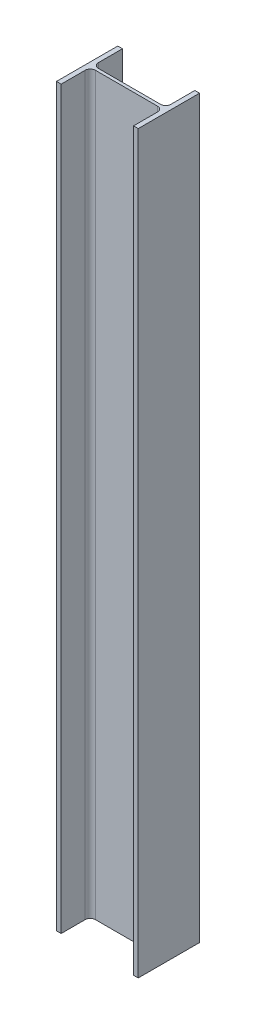
ISO-10303-21;
HEADER;
FILE_DESCRIPTION(('STEP AP214'),'2;1');
FILE_NAME('part.step','',(''),(''),'','','');
FILE_SCHEMA(('AUTOMOTIVE_DESIGN { 1 0 10303 214 1 1 1 1 }'));
ENDSEC;
DATA;
#1=APPLICATION_CONTEXT('core data for automotive mechanical design processes');
#2=APPLICATION_PROTOCOL_DEFINITION('international standard','automotive_design',2000,#1);
#3=PRODUCT_CONTEXT('',#1,'mechanical');
#4=PRODUCT('Part','Part','',(#3));
#5=PRODUCT_RELATED_PRODUCT_CATEGORY('part','',(#4));
#6=PRODUCT_DEFINITION_FORMATION('','',#4);
#7=PRODUCT_DEFINITION_CONTEXT('part definition',#1,'design');
#8=PRODUCT_DEFINITION('design','',#6,#7);
#9=PRODUCT_DEFINITION_SHAPE('','',#8);
#10=(LENGTH_UNIT() NAMED_UNIT(*) SI_UNIT(.MILLI.,.METRE.));
#11=(NAMED_UNIT(*) PLANE_ANGLE_UNIT() SI_UNIT($,.RADIAN.));
#12=(NAMED_UNIT(*) SI_UNIT($,.STERADIAN.) SOLID_ANGLE_UNIT());
#13=UNCERTAINTY_MEASURE_WITH_UNIT(LENGTH_MEASURE(1.E-05),#10,'distance_accuracy_value','');
#14=(GEOMETRIC_REPRESENTATION_CONTEXT(3) GLOBAL_UNCERTAINTY_ASSIGNED_CONTEXT((#13)) GLOBAL_UNIT_ASSIGNED_CONTEXT((#10,
#11,#12)) REPRESENTATION_CONTEXT('',''));
#15=CARTESIAN_POINT('',(0.,0.,0.));
#16=DIRECTION('',(0.,0.,1.));
#17=DIRECTION('',(1.,0.,0.));
#18=AXIS2_PLACEMENT_3D('',#15,#16,#17);
#19=CARTESIAN_POINT('',(104.775,457.2,-76.2000000000002));
#20=DIRECTION('',(-1.,0.,0.));
#21=DIRECTION('',(0.,0.,1.));
#22=AXIS2_PLACEMENT_3D('',#19,#20,#21);
#23=PLANE('',#22);
#24=DIRECTION('',(0.,0.,-1.));
#25=VECTOR('',#24,1.);
#26=CARTESIAN_POINT('',(104.775,-457.2,-76.2000000000002));
#27=LINE('',#26,#25);
#28=CARTESIAN_POINT('',(104.775,-457.2,-1.59594559789866E-13));
#29=VERTEX_POINT('',#28);
#30=CARTESIAN_POINT('',(104.775,-457.2,-76.2000000000002));
#31=VERTEX_POINT('',#30);
#32=EDGE_CURVE('E238',#29,#31,#27,.T.);
#33=ORIENTED_EDGE('',*,*,#32,.T.);
#34=DIRECTION('',(0.,-1.,0.));
#35=VECTOR('',#34,1.);
#36=CARTESIAN_POINT('',(104.775,457.2,-76.2000000000002));
#37=LINE('',#36,#35);
#38=CARTESIAN_POINT('',(104.775,457.2,-76.2000000000002));
#39=VERTEX_POINT('',#38);
#40=EDGE_CURVE('E13',#39,#31,#37,.T.);
#41=ORIENTED_EDGE('',*,*,#40,.F.);
#42=DIRECTION('',(0.,0.,-1.));
#43=VECTOR('',#42,1.);
#44=CARTESIAN_POINT('',(104.775,457.2,-76.2000000000002));
#45=LINE('',#44,#43);
#46=CARTESIAN_POINT('',(104.775,457.2,-1.59594559789866E-13));
#47=VERTEX_POINT('',#46);
#48=EDGE_CURVE('E268',#47,#39,#45,.T.);
#49=ORIENTED_EDGE('',*,*,#48,.F.);
#50=DIRECTION('',(0.,-1.,0.));
#51=VECTOR('',#50,1.);
#52=CARTESIAN_POINT('',(104.775,457.2,-1.59594559789866E-13));
#53=LINE('',#52,#51);
#54=EDGE_CURVE('E234',#47,#29,#53,.T.);
#55=ORIENTED_EDGE('',*,*,#54,.T.);
#56=EDGE_LOOP('',(#33,#41,#49,#55));
#57=FACE_BOUND('',#56,.T.);
#58=ADVANCED_FACE('F94',(#57),#23,.F.);
#59=CARTESIAN_POINT('',(98.9329999999999,457.2,-76.2000000000002));
#60=DIRECTION('',(0.,0.,1.));
#61=DIRECTION('',(1.,0.,0.));
#62=AXIS2_PLACEMENT_3D('',#59,#60,#61);
#63=PLANE('',#62);
#64=DIRECTION('',(-1.,0.,0.));
#65=VECTOR('',#64,1.);
#66=CARTESIAN_POINT('',(98.9329999999999,-457.2,-76.2000000000002));
#67=LINE('',#66,#65);
#68=CARTESIAN_POINT('',(98.9329999999999,-457.2,-76.2000000000002));
#69=VERTEX_POINT('',#68);
#70=EDGE_CURVE('E241',#31,#69,#67,.T.);
#71=ORIENTED_EDGE('',*,*,#70,.T.);
#72=DIRECTION('',(0.,-1.,0.));
#73=VECTOR('',#72,1.);
#74=CARTESIAN_POINT('',(98.9329999999999,457.2,-76.2000000000002));
#75=LINE('',#74,#73);
#76=CARTESIAN_POINT('',(98.9329999999999,457.2,-76.2000000000002));
#77=VERTEX_POINT('',#76);
#78=EDGE_CURVE('E102',#77,#69,#75,.T.);
#79=ORIENTED_EDGE('',*,*,#78,.F.);
#80=DIRECTION('',(-1.,0.,0.));
#81=VECTOR('',#80,1.);
#82=CARTESIAN_POINT('',(98.9329999999999,457.2,-76.2000000000002));
#83=LINE('',#82,#81);
#84=EDGE_CURVE('E177',#39,#77,#83,.T.);
#85=ORIENTED_EDGE('',*,*,#84,.F.);
#86=ORIENTED_EDGE('',*,*,#40,.T.);
#87=EDGE_LOOP('',(#71,#79,#85,#86));
#88=FACE_BOUND('',#87,.T.);
#89=ADVANCED_FACE('F366',(#88),#63,.F.);
#90=CARTESIAN_POINT('',(98.933,457.2,-46.3550000000002));
#91=DIRECTION('',(1.,0.,0.));
#92=DIRECTION('',(0.,0.,-1.));
#93=AXIS2_PLACEMENT_3D('',#90,#91,#92);
#94=PLANE('',#93);
#95=DIRECTION('',(0.,0.,1.));
#96=VECTOR('',#95,1.);
#97=CARTESIAN_POINT('',(98.933,-457.2,-46.3550000000002));
#98=LINE('',#97,#96);
#99=CARTESIAN_POINT('',(98.933,-457.2,-46.3550000000002));
#100=VERTEX_POINT('',#99);
#101=EDGE_CURVE('E243',#69,#100,#98,.T.);
#102=ORIENTED_EDGE('',*,*,#101,.T.);
#103=DIRECTION('',(0.,-1.,0.));
#104=VECTOR('',#103,1.);
#105=CARTESIAN_POINT('',(98.933,457.2,-46.3550000000002));
#106=LINE('',#105,#104);
#107=CARTESIAN_POINT('',(98.933,457.2,-46.3550000000002));
#108=VERTEX_POINT('',#107);
#109=EDGE_CURVE('E299',#108,#100,#106,.T.);
#110=ORIENTED_EDGE('',*,*,#109,.F.);
#111=DIRECTION('',(0.,0.,1.));
#112=VECTOR('',#111,1.);
#113=CARTESIAN_POINT('',(98.933,457.2,-46.3550000000002));
#114=LINE('',#113,#112);
#115=EDGE_CURVE('E307',#77,#108,#114,.T.);
#116=ORIENTED_EDGE('',*,*,#115,.F.);
#117=ORIENTED_EDGE('',*,*,#78,.T.);
#118=EDGE_LOOP('',(#102,#110,#116,#117));
#119=FACE_BOUND('',#118,.T.);
#120=ADVANCED_FACE('F305',(#119),#94,.F.);
#121=CARTESIAN_POINT('',(92.5829999999999,457.2,-46.3550000000001));
#122=DIRECTION('',(0.,-1.,0.));
#123=DIRECTION('',(0.,0.,-1.));
#124=AXIS2_PLACEMENT_3D('',#121,#122,#123);
#125=CYLINDRICAL_SURFACE('',#124,6.35000000000001);
#126=CARTESIAN_POINT('',(92.5829999999999,-457.2,-46.3550000000001));
#127=DIRECTION('',(0.,-1.,0.));
#128=DIRECTION('',(0.,0.,1.));
#129=AXIS2_PLACEMENT_3D('',#126,#127,#128);
#130=CIRCLE('',#129,6.35000000000001);
#131=CARTESIAN_POINT('',(92.583,-457.2,-40.0050000000002));
#132=VERTEX_POINT('',#131);
#133=EDGE_CURVE('E245',#100,#132,#130,.T.);
#134=ORIENTED_EDGE('',*,*,#133,.T.);
#135=DIRECTION('',(0.,-1.,0.));
#136=VECTOR('',#135,1.);
#137=CARTESIAN_POINT('',(92.583,457.2,-40.0050000000002));
#138=LINE('',#137,#136);
#139=CARTESIAN_POINT('',(92.583,457.2,-40.0050000000002));
#140=VERTEX_POINT('',#139);
#141=EDGE_CURVE('E296',#140,#132,#138,.T.);
#142=ORIENTED_EDGE('',*,*,#141,.F.);
#143=CARTESIAN_POINT('',(92.5829999999999,457.2,-46.3550000000001));
#144=DIRECTION('',(0.,-1.,0.));
#145=DIRECTION('',(0.,0.,1.));
#146=AXIS2_PLACEMENT_3D('',#143,#144,#145);
#147=CIRCLE('',#146,6.35000000000001);
#148=EDGE_CURVE('E325',#108,#140,#147,.T.);
#149=ORIENTED_EDGE('',*,*,#148,.F.);
#150=ORIENTED_EDGE('',*,*,#109,.T.);
#151=EDGE_LOOP('',(#134,#142,#149,#150));
#152=FACE_BOUND('',#151,.T.);
#153=ADVANCED_FACE('F316',(#152),#125,.F.);
#154=CARTESIAN_POINT('',(15.367,457.2,-40.0049999999999));
#155=DIRECTION('',(0.,0.,1.));
#156=DIRECTION('',(1.,0.,0.));
#157=AXIS2_PLACEMENT_3D('',#154,#155,#156);
#158=PLANE('',#157);
#159=DIRECTION('',(-1.,0.,0.));
#160=VECTOR('',#159,1.);
#161=CARTESIAN_POINT('',(15.367,-457.2,-40.0049999999999));
#162=LINE('',#161,#160);
#163=CARTESIAN_POINT('',(15.367,-457.2,-40.0049999999999));
#164=VERTEX_POINT('',#163);
#165=EDGE_CURVE('E247',#132,#164,#162,.T.);
#166=ORIENTED_EDGE('',*,*,#165,.T.);
#167=DIRECTION('',(0.,-1.,0.));
#168=VECTOR('',#167,1.);
#169=CARTESIAN_POINT('',(15.367,457.2,-40.0049999999999));
#170=LINE('',#169,#168);
#171=CARTESIAN_POINT('',(15.367,457.2,-40.0049999999999));
#172=VERTEX_POINT('',#171);
#173=EDGE_CURVE('E293',#172,#164,#170,.T.);
#174=ORIENTED_EDGE('',*,*,#173,.F.);
#175=DIRECTION('',(-1.,0.,0.));
#176=VECTOR('',#175,1.);
#177=CARTESIAN_POINT('',(15.367,457.2,-40.0049999999999));
#178=LINE('',#177,#176);
#179=EDGE_CURVE('E322',#140,#172,#178,.T.);
#180=ORIENTED_EDGE('',*,*,#179,.F.);
#181=ORIENTED_EDGE('',*,*,#141,.T.);
#182=EDGE_LOOP('',(#166,#174,#180,#181));
#183=FACE_BOUND('',#182,.T.);
#184=ADVANCED_FACE('F320',(#183),#158,.F.);
#185=CARTESIAN_POINT('',(15.367,457.2,-46.3549999999999));
#186=DIRECTION('',(0.,-1.,0.));
#187=DIRECTION('',(0.,0.,-1.));
#188=AXIS2_PLACEMENT_3D('',#185,#186,#187);
#189=CYLINDRICAL_SURFACE('',#188,6.35000000000001);
#190=CARTESIAN_POINT('',(15.367,-457.2,-46.3549999999999));
#191=DIRECTION('',(0.,-1.,0.));
#192=DIRECTION('',(0.,0.,1.));
#193=AXIS2_PLACEMENT_3D('',#190,#191,#192);
#194=CIRCLE('',#193,6.35000000000001);
#195=CARTESIAN_POINT('',(9.01699999999996,-457.2,-46.3549999999999));
#196=VERTEX_POINT('',#195);
#197=EDGE_CURVE('E249',#164,#196,#194,.T.);
#198=ORIENTED_EDGE('',*,*,#197,.T.);
#199=DIRECTION('',(0.,-1.,0.));
#200=VECTOR('',#199,1.);
#201=CARTESIAN_POINT('',(9.01699999999996,457.2,-46.3549999999999));
#202=LINE('',#201,#200);
#203=CARTESIAN_POINT('',(9.01699999999996,457.2,-46.3549999999999));
#204=VERTEX_POINT('',#203);
#205=EDGE_CURVE('E290',#204,#196,#202,.T.);
#206=ORIENTED_EDGE('',*,*,#205,.F.);
#207=CARTESIAN_POINT('',(15.367,457.2,-46.3549999999999));
#208=DIRECTION('',(0.,-1.,0.));
#209=DIRECTION('',(0.,0.,1.));
#210=AXIS2_PLACEMENT_3D('',#207,#208,#209);
#211=CIRCLE('',#210,6.35000000000001);
#212=EDGE_CURVE('E324',#172,#204,#211,.T.);
#213=ORIENTED_EDGE('',*,*,#212,.F.);
#214=ORIENTED_EDGE('',*,*,#173,.T.);
#215=EDGE_LOOP('',(#198,#206,#213,#214));
#216=FACE_BOUND('',#215,.T.);
#217=ADVANCED_FACE('F379',(#216),#189,.F.);
#218=CARTESIAN_POINT('',(9.01699999999987,457.2,-76.1999999999999));
#219=DIRECTION('',(-1.,0.,0.));
#220=DIRECTION('',(0.,0.,1.));
#221=AXIS2_PLACEMENT_3D('',#218,#219,#220);
#222=PLANE('',#221);
#223=DIRECTION('',(0.,0.,-1.));
#224=VECTOR('',#223,1.);
#225=CARTESIAN_POINT('',(9.01699999999987,-457.2,-76.1999999999999));
#226=LINE('',#225,#224);
#227=CARTESIAN_POINT('',(9.01699999999987,-457.2,-76.1999999999999));
#228=VERTEX_POINT('',#227);
#229=EDGE_CURVE('E251',#196,#228,#226,.T.);
#230=ORIENTED_EDGE('',*,*,#229,.T.);
#231=DIRECTION('',(0.,-1.,0.));
#232=VECTOR('',#231,1.);
#233=CARTESIAN_POINT('',(9.01699999999987,457.2,-76.1999999999999));
#234=LINE('',#233,#232);
#235=CARTESIAN_POINT('',(9.01699999999987,457.2,-76.1999999999999));
#236=VERTEX_POINT('',#235);
#237=EDGE_CURVE('E287',#236,#228,#234,.T.);
#238=ORIENTED_EDGE('',*,*,#237,.F.);
#239=DIRECTION('',(0.,0.,-1.));
#240=VECTOR('',#239,1.);
#241=CARTESIAN_POINT('',(9.01699999999987,457.2,-76.1999999999999));
#242=LINE('',#241,#240);
#243=EDGE_CURVE('E327',#204,#236,#242,.T.);
#244=ORIENTED_EDGE('',*,*,#243,.F.);
#245=ORIENTED_EDGE('',*,*,#205,.T.);
#246=EDGE_LOOP('',(#230,#238,#244,#245));
#247=FACE_BOUND('',#246,.T.);
#248=ADVANCED_FACE('F382',(#247),#222,.F.);
#249=CARTESIAN_POINT('',(3.17499999999985,457.2,-76.1999999999998));
#250=DIRECTION('',(0.,0.,1.));
#251=DIRECTION('',(1.,0.,0.));
#252=AXIS2_PLACEMENT_3D('',#249,#250,#251);
#253=PLANE('',#252);
#254=DIRECTION('',(-1.,0.,0.));
#255=VECTOR('',#254,1.);
#256=CARTESIAN_POINT('',(3.17499999999985,-457.2,-76.1999999999998));
#257=LINE('',#256,#255);
#258=CARTESIAN_POINT('',(3.17499999999985,-457.2,-76.1999999999998));
#259=VERTEX_POINT('',#258);
#260=EDGE_CURVE('E253',#228,#259,#257,.T.);
#261=ORIENTED_EDGE('',*,*,#260,.T.);
#262=DIRECTION('',(0.,-1.,0.));
#263=VECTOR('',#262,1.);
#264=CARTESIAN_POINT('',(3.17499999999985,457.2,-76.1999999999998));
#265=LINE('',#264,#263);
#266=CARTESIAN_POINT('',(3.17499999999985,457.2,-76.1999999999998));
#267=VERTEX_POINT('',#266);
#268=EDGE_CURVE('E284',#267,#259,#265,.T.);
#269=ORIENTED_EDGE('',*,*,#268,.F.);
#270=DIRECTION('',(-1.,0.,0.));
#271=VECTOR('',#270,1.);
#272=CARTESIAN_POINT('',(3.17499999999985,457.2,-76.1999999999998));
#273=LINE('',#272,#271);
#274=EDGE_CURVE('E333',#236,#267,#273,.T.);
#275=ORIENTED_EDGE('',*,*,#274,.F.);
#276=ORIENTED_EDGE('',*,*,#237,.T.);
#277=EDGE_LOOP('',(#261,#269,#275,#276));
#278=FACE_BOUND('',#277,.T.);
#279=ADVANCED_FACE('F386',(#278),#253,.F.);
#280=CARTESIAN_POINT('',(3.17500000000012,457.2,1.87350135405495E-13));
#281=DIRECTION('',(1.,0.,0.));
#282=DIRECTION('',(0.,0.,-1.));
#283=AXIS2_PLACEMENT_3D('',#280,#281,#282);
#284=PLANE('',#283);
#285=DIRECTION('',(0.,0.,1.));
#286=VECTOR('',#285,1.);
#287=CARTESIAN_POINT('',(3.17500000000012,-457.2,1.87350135405495E-13));
#288=LINE('',#287,#286);
#289=CARTESIAN_POINT('',(3.17500000000012,-457.2,1.87350135405495E-13));
#290=VERTEX_POINT('',#289);
#291=EDGE_CURVE('E255',#259,#290,#288,.T.);
#292=ORIENTED_EDGE('',*,*,#291,.T.);
#293=DIRECTION('',(0.,-1.,0.));
#294=VECTOR('',#293,1.);
#295=CARTESIAN_POINT('',(3.17500000000012,457.2,1.87350135405495E-13));
#296=LINE('',#295,#294);
#297=CARTESIAN_POINT('',(3.17500000000012,457.2,1.87350135405495E-13));
#298=VERTEX_POINT('',#297);
#299=EDGE_CURVE('E281',#298,#290,#296,.T.);
#300=ORIENTED_EDGE('',*,*,#299,.F.);
#301=DIRECTION('',(0.,0.,1.));
#302=VECTOR('',#301,1.);
#303=CARTESIAN_POINT('',(3.17500000000012,457.2,1.87350135405495E-13));
#304=LINE('',#303,#302);
#305=EDGE_CURVE('E335',#267,#298,#304,.T.);
#306=ORIENTED_EDGE('',*,*,#305,.F.);
#307=ORIENTED_EDGE('',*,*,#268,.T.);
#308=EDGE_LOOP('',(#292,#300,#306,#307));
#309=FACE_BOUND('',#308,.T.);
#310=ADVANCED_FACE('F390',(#309),#284,.F.);
#311=CARTESIAN_POINT('',(9.01700000000014,457.2,1.94289029309402E-13));
#312=DIRECTION('',(0.,0.,-1.));
#313=DIRECTION('',(-1.,0.,0.));
#314=AXIS2_PLACEMENT_3D('',#311,#312,#313);
#315=PLANE('',#314);
#316=DIRECTION('',(1.,0.,0.));
#317=VECTOR('',#316,1.);
#318=CARTESIAN_POINT('',(9.01700000000014,-457.2,1.94289029309402E-13));
#319=LINE('',#318,#317);
#320=CARTESIAN_POINT('',(9.01700000000014,-457.2,1.94289029309402E-13));
#321=VERTEX_POINT('',#320);
#322=EDGE_CURVE('E257',#290,#321,#319,.T.);
#323=ORIENTED_EDGE('',*,*,#322,.T.);
#324=DIRECTION('',(0.,-1.,0.));
#325=VECTOR('',#324,1.);
#326=CARTESIAN_POINT('',(9.01700000000014,457.2,1.94289029309402E-13));
#327=LINE('',#326,#325);
#328=CARTESIAN_POINT('',(9.01700000000014,457.2,1.94289029309402E-13));
#329=VERTEX_POINT('',#328);
#330=EDGE_CURVE('E278',#329,#321,#327,.T.);
#331=ORIENTED_EDGE('',*,*,#330,.F.);
#332=DIRECTION('',(1.,0.,0.));
#333=VECTOR('',#332,1.);
#334=CARTESIAN_POINT('',(9.01700000000014,457.2,1.94289029309402E-13));
#335=LINE('',#334,#333);
#336=EDGE_CURVE('E337',#298,#329,#335,.T.);
#337=ORIENTED_EDGE('',*,*,#336,.F.);
#338=ORIENTED_EDGE('',*,*,#299,.T.);
#339=EDGE_LOOP('',(#323,#331,#337,#338));
#340=FACE_BOUND('',#339,.T.);
#341=ADVANCED_FACE('F394',(#340),#315,.F.);
#342=CARTESIAN_POINT('',(9.01700000000002,457.2,-29.8449999999998));
#343=DIRECTION('',(-1.,0.,0.));
#344=DIRECTION('',(0.,0.,1.));
#345=AXIS2_PLACEMENT_3D('',#342,#343,#344);
#346=PLANE('',#345);
#347=DIRECTION('',(0.,0.,-1.));
#348=VECTOR('',#347,1.);
#349=CARTESIAN_POINT('',(9.01700000000002,-457.2,-29.8449999999998));
#350=LINE('',#349,#348);
#351=CARTESIAN_POINT('',(9.01700000000003,-457.2,-29.8449999999998));
#352=VERTEX_POINT('',#351);
#353=EDGE_CURVE('E259',#321,#352,#350,.T.);
#354=ORIENTED_EDGE('',*,*,#353,.T.);
#355=DIRECTION('',(0.,-1.,0.));
#356=VECTOR('',#355,1.);
#357=CARTESIAN_POINT('',(9.01700000000003,457.2,-29.8449999999998));
#358=LINE('',#357,#356);
#359=CARTESIAN_POINT('',(9.01700000000003,457.2,-29.8449999999998));
#360=VERTEX_POINT('',#359);
#361=EDGE_CURVE('E275',#360,#352,#358,.T.);
#362=ORIENTED_EDGE('',*,*,#361,.F.);
#363=DIRECTION('',(0.,0.,-1.));
#364=VECTOR('',#363,1.);
#365=CARTESIAN_POINT('',(9.01700000000002,457.2,-29.8449999999998));
#366=LINE('',#365,#364);
#367=EDGE_CURVE('E339',#329,#360,#366,.T.);
#368=ORIENTED_EDGE('',*,*,#367,.F.);
#369=ORIENTED_EDGE('',*,*,#330,.T.);
#370=EDGE_LOOP('',(#354,#362,#368,#369));
#371=FACE_BOUND('',#370,.T.);
#372=ADVANCED_FACE('F398',(#371),#346,.F.);
#373=CARTESIAN_POINT('',(15.367,457.2,-29.8449999999999));
#374=DIRECTION('',(0.,-1.,0.));
#375=DIRECTION('',(0.,0.,-1.));
#376=AXIS2_PLACEMENT_3D('',#373,#374,#375);
#377=CYLINDRICAL_SURFACE('',#376,6.35000000000001);
#378=CARTESIAN_POINT('',(15.367,-457.2,-29.8449999999999));
#379=DIRECTION('',(0.,-1.,0.));
#380=DIRECTION('',(0.,0.,1.));
#381=AXIS2_PLACEMENT_3D('',#378,#379,#380);
#382=CIRCLE('',#381,6.35000000000001);
#383=CARTESIAN_POINT('',(15.367,-457.2,-36.1949999999999));
#384=VERTEX_POINT('',#383);
#385=EDGE_CURVE('E261',#352,#384,#382,.T.);
#386=ORIENTED_EDGE('',*,*,#385,.T.);
#387=DIRECTION('',(0.,-1.,0.));
#388=VECTOR('',#387,1.);
#389=CARTESIAN_POINT('',(15.367,457.2,-36.1949999999999));
#390=LINE('',#389,#388);
#391=CARTESIAN_POINT('',(15.367,457.2,-36.1949999999999));
#392=VERTEX_POINT('',#391);
#393=EDGE_CURVE('E272',#392,#384,#390,.T.);
#394=ORIENTED_EDGE('',*,*,#393,.F.);
#395=CARTESIAN_POINT('',(15.367,457.2,-29.8449999999999));
#396=DIRECTION('',(0.,-1.,0.));
#397=DIRECTION('',(0.,0.,1.));
#398=AXIS2_PLACEMENT_3D('',#395,#396,#397);
#399=CIRCLE('',#398,6.35000000000001);
#400=EDGE_CURVE('E341',#360,#392,#399,.T.);
#401=ORIENTED_EDGE('',*,*,#400,.F.);
#402=ORIENTED_EDGE('',*,*,#361,.T.);
#403=EDGE_LOOP('',(#386,#394,#401,#402));
#404=FACE_BOUND('',#403,.T.);
#405=ADVANCED_FACE('F347',(#404),#377,.F.);
#406=CARTESIAN_POINT('',(92.583,457.2,-36.1950000000001));
#407=DIRECTION('',(0.,0.,-1.));
#408=DIRECTION('',(-1.,0.,0.));
#409=AXIS2_PLACEMENT_3D('',#406,#407,#408);
#410=PLANE('',#409);
#411=DIRECTION('',(1.,0.,0.));
#412=VECTOR('',#411,1.);
#413=CARTESIAN_POINT('',(92.583,-457.2,-36.1950000000001));
#414=LINE('',#413,#412);
#415=CARTESIAN_POINT('',(92.583,-457.2,-36.1950000000001));
#416=VERTEX_POINT('',#415);
#417=EDGE_CURVE('E263',#384,#416,#414,.T.);
#418=ORIENTED_EDGE('',*,*,#417,.T.);
#419=DIRECTION('',(0.,-1.,0.));
#420=VECTOR('',#419,1.);
#421=CARTESIAN_POINT('',(92.583,457.2,-36.1950000000001));
#422=LINE('',#421,#420);
#423=CARTESIAN_POINT('',(92.583,457.2,-36.1950000000001));
#424=VERTEX_POINT('',#423);
#425=EDGE_CURVE('E229',#424,#416,#422,.T.);
#426=ORIENTED_EDGE('',*,*,#425,.F.);
#427=DIRECTION('',(1.,0.,0.));
#428=VECTOR('',#427,1.);
#429=CARTESIAN_POINT('',(92.583,457.2,-36.1950000000001));
#430=LINE('',#429,#428);
#431=EDGE_CURVE('E220',#392,#424,#430,.T.);
#432=ORIENTED_EDGE('',*,*,#431,.F.);
#433=ORIENTED_EDGE('',*,*,#393,.T.);
#434=EDGE_LOOP('',(#418,#426,#432,#433));
#435=FACE_BOUND('',#434,.T.);
#436=ADVANCED_FACE('F351',(#435),#410,.F.);
#437=CARTESIAN_POINT('',(92.583,457.2,-29.8450000000001));
#438=DIRECTION('',(0.,-1.,0.));
#439=DIRECTION('',(0.,0.,-1.));
#440=AXIS2_PLACEMENT_3D('',#437,#438,#439);
#441=CYLINDRICAL_SURFACE('',#440,6.35000000000001);
#442=CARTESIAN_POINT('',(92.583,-457.2,-29.8450000000001));
#443=DIRECTION('',(0.,-1.,0.));
#444=DIRECTION('',(0.,0.,1.));
#445=AXIS2_PLACEMENT_3D('',#442,#443,#444);
#446=CIRCLE('',#445,6.35000000000001);
#447=CARTESIAN_POINT('',(98.933,-457.2,-29.8450000000001));
#448=VERTEX_POINT('',#447);
#449=EDGE_CURVE('E228',#416,#448,#446,.T.);
#450=ORIENTED_EDGE('',*,*,#449,.T.);
#451=DIRECTION('',(0.,-1.,0.));
#452=VECTOR('',#451,1.);
#453=CARTESIAN_POINT('',(98.933,457.2,-29.8450000000001));
#454=LINE('',#453,#452);
#455=CARTESIAN_POINT('',(98.933,457.2,-29.8450000000001));
#456=VERTEX_POINT('',#455);
#457=EDGE_CURVE('E225',#456,#448,#454,.T.);
#458=ORIENTED_EDGE('',*,*,#457,.F.);
#459=CARTESIAN_POINT('',(92.583,457.2,-29.8450000000001));
#460=DIRECTION('',(0.,-1.,0.));
#461=DIRECTION('',(0.,0.,1.));
#462=AXIS2_PLACEMENT_3D('',#459,#460,#461);
#463=CIRCLE('',#462,6.35000000000001);
#464=EDGE_CURVE('E214',#424,#456,#463,.T.);
#465=ORIENTED_EDGE('',*,*,#464,.F.);
#466=ORIENTED_EDGE('',*,*,#425,.T.);
#467=EDGE_LOOP('',(#450,#458,#465,#466));
#468=FACE_BOUND('',#467,.T.);
#469=ADVANCED_FACE('F226',(#468),#441,.F.);
#470=CARTESIAN_POINT('',(98.9330000000001,457.2,-1.38777878078145E-13));
#471=DIRECTION('',(1.,0.,0.));
#472=DIRECTION('',(0.,0.,-1.));
#473=AXIS2_PLACEMENT_3D('',#470,#471,#472);
#474=PLANE('',#473);
#475=DIRECTION('',(0.,0.,1.));
#476=VECTOR('',#475,1.);
#477=CARTESIAN_POINT('',(98.9330000000001,-457.2,-1.38777878078145E-13));
#478=LINE('',#477,#476);
#479=CARTESIAN_POINT('',(98.9330000000001,-457.2,-1.38777878078145E-13));
#480=VERTEX_POINT('',#479);
#481=EDGE_CURVE('E163',#448,#480,#478,.T.);
#482=ORIENTED_EDGE('',*,*,#481,.T.);
#483=DIRECTION('',(0.,-1.,0.));
#484=VECTOR('',#483,1.);
#485=CARTESIAN_POINT('',(98.9330000000001,457.2,-1.38777878078145E-13));
#486=LINE('',#485,#484);
#487=CARTESIAN_POINT('',(98.9330000000001,457.2,-1.38777878078145E-13));
#488=VERTEX_POINT('',#487);
#489=EDGE_CURVE('E230',#488,#480,#486,.T.);
#490=ORIENTED_EDGE('',*,*,#489,.F.);
#491=DIRECTION('',(0.,0.,1.));
#492=VECTOR('',#491,1.);
#493=CARTESIAN_POINT('',(98.9330000000001,457.2,-1.38777878078145E-13));
#494=LINE('',#493,#492);
#495=EDGE_CURVE('E218',#456,#488,#494,.T.);
#496=ORIENTED_EDGE('',*,*,#495,.F.);
#497=ORIENTED_EDGE('',*,*,#457,.T.);
#498=EDGE_LOOP('',(#482,#490,#496,#497));
#499=FACE_BOUND('',#498,.T.);
#500=ADVANCED_FACE('F232',(#499),#474,.F.);
#501=CARTESIAN_POINT('',(104.775,457.2,-1.59594559789866E-13));
#502=DIRECTION('',(0.,0.,-1.));
#503=DIRECTION('',(-1.,0.,0.));
#504=AXIS2_PLACEMENT_3D('',#501,#502,#503);
#505=PLANE('',#504);
#506=DIRECTION('',(1.,0.,0.));
#507=VECTOR('',#506,1.);
#508=CARTESIAN_POINT('',(104.775,-457.2,-1.59594559789866E-13));
#509=LINE('',#508,#507);
#510=EDGE_CURVE('E169',#480,#29,#509,.T.);
#511=ORIENTED_EDGE('',*,*,#510,.T.);
#512=ORIENTED_EDGE('',*,*,#54,.F.);
#513=DIRECTION('',(1.,0.,0.));
#514=VECTOR('',#513,1.);
#515=CARTESIAN_POINT('',(104.775,457.2,-1.59594559789866E-13));
#516=LINE('',#515,#514);
#517=EDGE_CURVE('E110',#488,#47,#516,.T.);
#518=ORIENTED_EDGE('',*,*,#517,.F.);
#519=ORIENTED_EDGE('',*,*,#489,.T.);
#520=EDGE_LOOP('',(#511,#512,#518,#519));
#521=FACE_BOUND('',#520,.T.);
#522=ADVANCED_FACE('F355',(#521),#505,.F.);
#523=CARTESIAN_POINT('',(92.583,457.2,-29.8450000000001));
#524=DIRECTION('',(0.,1.,0.));
#525=DIRECTION('',(0.,0.,1.));
#526=AXIS2_PLACEMENT_3D('',#523,#524,#525);
#527=PLANE('',#526);
#528=ORIENTED_EDGE('',*,*,#48,.T.);
#529=ORIENTED_EDGE('',*,*,#84,.T.);
#530=ORIENTED_EDGE('',*,*,#115,.T.);
#531=ORIENTED_EDGE('',*,*,#148,.T.);
#532=ORIENTED_EDGE('',*,*,#179,.T.);
#533=ORIENTED_EDGE('',*,*,#212,.T.);
#534=ORIENTED_EDGE('',*,*,#243,.T.);
#535=ORIENTED_EDGE('',*,*,#274,.T.);
#536=ORIENTED_EDGE('',*,*,#305,.T.);
#537=ORIENTED_EDGE('',*,*,#336,.T.);
#538=ORIENTED_EDGE('',*,*,#367,.T.);
#539=ORIENTED_EDGE('',*,*,#400,.T.);
#540=ORIENTED_EDGE('',*,*,#431,.T.);
#541=ORIENTED_EDGE('',*,*,#464,.T.);
#542=ORIENTED_EDGE('',*,*,#495,.T.);
#543=ORIENTED_EDGE('',*,*,#517,.T.);
#544=EDGE_LOOP('',(#528,#529,#530,#531,#532,#533,#534,#535,#536,#537,#538,#539,#540,#541,#542,#543));
#545=FACE_BOUND('',#544,.T.);
#546=ADVANCED_FACE('F216',(#545),#527,.T.);
#547=CARTESIAN_POINT('',(92.583,-457.2,-29.8450000000001));
#548=DIRECTION('',(0.,1.,0.));
#549=DIRECTION('',(0.,0.,1.));
#550=AXIS2_PLACEMENT_3D('',#547,#548,#549);
#551=PLANE('',#550);
#552=ORIENTED_EDGE('',*,*,#32,.F.);
#553=ORIENTED_EDGE('',*,*,#510,.F.);
#554=ORIENTED_EDGE('',*,*,#481,.F.);
#555=ORIENTED_EDGE('',*,*,#449,.F.);
#556=ORIENTED_EDGE('',*,*,#417,.F.);
#557=ORIENTED_EDGE('',*,*,#385,.F.);
#558=ORIENTED_EDGE('',*,*,#353,.F.);
#559=ORIENTED_EDGE('',*,*,#322,.F.);
#560=ORIENTED_EDGE('',*,*,#291,.F.);
#561=ORIENTED_EDGE('',*,*,#260,.F.);
#562=ORIENTED_EDGE('',*,*,#229,.F.);
#563=ORIENTED_EDGE('',*,*,#197,.F.);
#564=ORIENTED_EDGE('',*,*,#165,.F.);
#565=ORIENTED_EDGE('',*,*,#133,.F.);
#566=ORIENTED_EDGE('',*,*,#101,.F.);
#567=ORIENTED_EDGE('',*,*,#70,.F.);
#568=EDGE_LOOP('',(#552,#553,#554,#555,#556,#557,#558,#559,#560,#561,#562,#563,#564,#565,#566,#567));
#569=FACE_BOUND('',#568,.T.);
#570=ADVANCED_FACE('F311',(#569),#551,.F.);
#571=CLOSED_SHELL('',(#58,#89,#120,#153,#184,#217,#248,#279,#310,#341,#372,#405,#436,#469,#500,
#522,#546,#570));
#572=MANIFOLD_SOLID_BREP('B2',#571);
#573=ADVANCED_BREP_SHAPE_REPRESENTATION('',(#18,#572),#14);
#574=SHAPE_DEFINITION_REPRESENTATION(#9,#573);
ENDSEC;
END-ISO-10303-21;
